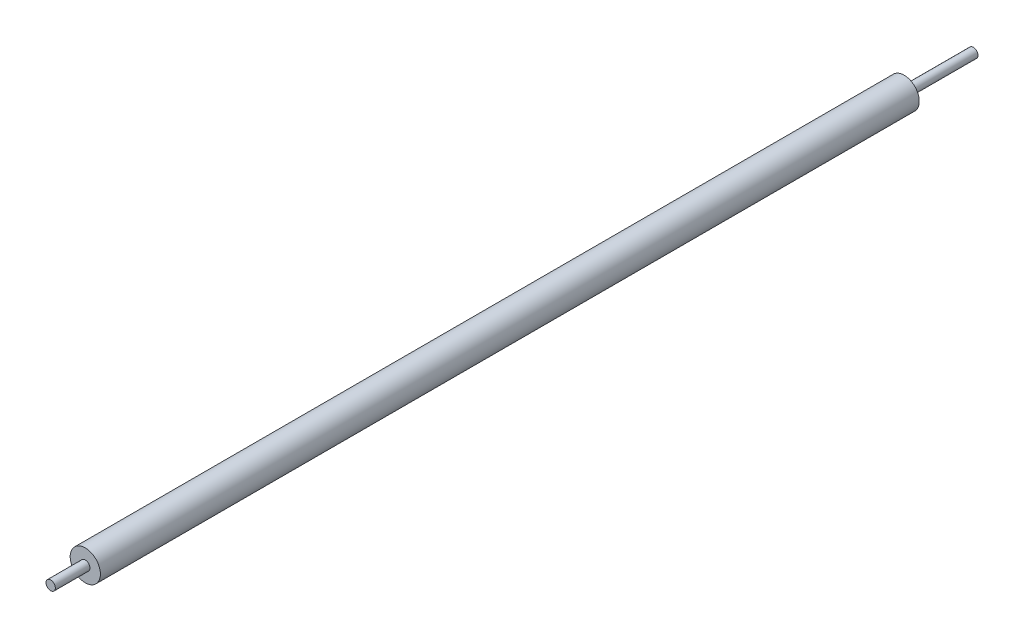
ISO-10303-21;
HEADER;
FILE_DESCRIPTION(('STEP AP214'),'2;1');
FILE_NAME('part.step','',(''),(''),'','','');
FILE_SCHEMA(('AUTOMOTIVE_DESIGN { 1 0 10303 214 1 1 1 1 }'));
ENDSEC;
DATA;
#1=APPLICATION_CONTEXT('core data for automotive mechanical design processes');
#2=APPLICATION_PROTOCOL_DEFINITION('international standard','automotive_design',2000,#1);
#3=PRODUCT_CONTEXT('',#1,'mechanical');
#4=PRODUCT('Part','Part','',(#3));
#5=PRODUCT_RELATED_PRODUCT_CATEGORY('part','',(#4));
#6=PRODUCT_DEFINITION_FORMATION('','',#4);
#7=PRODUCT_DEFINITION_CONTEXT('part definition',#1,'design');
#8=PRODUCT_DEFINITION('design','',#6,#7);
#9=PRODUCT_DEFINITION_SHAPE('','',#8);
#10=(LENGTH_UNIT() NAMED_UNIT(*) SI_UNIT(.MILLI.,.METRE.));
#11=(NAMED_UNIT(*) PLANE_ANGLE_UNIT() SI_UNIT($,.RADIAN.));
#12=(NAMED_UNIT(*) SI_UNIT($,.STERADIAN.) SOLID_ANGLE_UNIT());
#13=UNCERTAINTY_MEASURE_WITH_UNIT(LENGTH_MEASURE(1.E-05),#10,'distance_accuracy_value','');
#14=(GEOMETRIC_REPRESENTATION_CONTEXT(3) GLOBAL_UNCERTAINTY_ASSIGNED_CONTEXT((#13)) GLOBAL_UNIT_ASSIGNED_CONTEXT((#10,
#11,#12)) REPRESENTATION_CONTEXT('',''));
#15=CARTESIAN_POINT('',(0.,0.,0.));
#16=DIRECTION('',(0.,0.,1.));
#17=DIRECTION('',(1.,0.,0.));
#18=AXIS2_PLACEMENT_3D('',#15,#16,#17);
#19=CARTESIAN_POINT('',(0.,0.,83.7052395334175));
#20=DIRECTION('',(0.,0.,-1.));
#21=DIRECTION('',(-1.,0.,0.));
#22=AXIS2_PLACEMENT_3D('',#19,#20,#21);
#23=CYLINDRICAL_SURFACE('',#22,1.31);
#24=CARTESIAN_POINT('',(0.,0.,6.));
#25=DIRECTION('',(0.,0.,1.));
#26=DIRECTION('',(1.,0.,0.));
#27=AXIS2_PLACEMENT_3D('',#24,#25,#26);
#28=CIRCLE('',#27,1.31);
#29=CARTESIAN_POINT('',(1.31,0.,6.));
#30=VERTEX_POINT('',#29);
#31=EDGE_CURVE('E53',#30,#30,#28,.T.);
#32=ORIENTED_EDGE('',*,*,#31,.T.);
#33=EDGE_LOOP('',(#32));
#34=FACE_BOUND('',#33,.T.);
#35=CARTESIAN_POINT('',(0.,0.,77.));
#36=DIRECTION('',(0.,0.,1.));
#37=DIRECTION('',(1.,0.,0.));
#38=AXIS2_PLACEMENT_3D('',#35,#36,#37);
#39=CIRCLE('',#38,1.31);
#40=CARTESIAN_POINT('',(1.31,0.,77.));
#41=VERTEX_POINT('',#40);
#42=EDGE_CURVE('E11',#41,#41,#39,.T.);
#43=ORIENTED_EDGE('',*,*,#42,.F.);
#44=EDGE_LOOP('',(#43));
#45=FACE_BOUND('',#44,.T.);
#46=ADVANCED_FACE('F46',(#34,#45),#23,.T.);
#47=CARTESIAN_POINT('',(0.,0.,6.));
#48=DIRECTION('',(0.,0.,1.));
#49=DIRECTION('',(1.,0.,0.));
#50=AXIS2_PLACEMENT_3D('',#47,#48,#49);
#51=PLANE('',#50);
#52=ORIENTED_EDGE('',*,*,#31,.F.);
#53=EDGE_LOOP('',(#52));
#54=FACE_BOUND('',#53,.T.);
#55=CARTESIAN_POINT('',(0.,0.,6.));
#56=DIRECTION('',(0.,0.,1.));
#57=DIRECTION('',(1.,0.,0.));
#58=AXIS2_PLACEMENT_3D('',#55,#56,#57);
#59=CIRCLE('',#58,0.4064);
#60=CARTESIAN_POINT('',(0.4064,0.,6.));
#61=VERTEX_POINT('',#60);
#62=EDGE_CURVE('E58',#61,#61,#59,.T.);
#63=ORIENTED_EDGE('',*,*,#62,.T.);
#64=EDGE_LOOP('',(#63));
#65=FACE_BOUND('',#64,.T.);
#66=ADVANCED_FACE('F74',(#54,#65),#51,.F.);
#67=CARTESIAN_POINT('',(0.,0.,83.7052395334175));
#68=DIRECTION('',(0.,0.,-1.));
#69=DIRECTION('',(-1.,0.,0.));
#70=AXIS2_PLACEMENT_3D('',#67,#68,#69);
#71=CYLINDRICAL_SURFACE('',#70,0.4064);
#72=ORIENTED_EDGE('',*,*,#62,.F.);
#73=EDGE_LOOP('',(#72));
#74=FACE_BOUND('',#73,.T.);
#75=CARTESIAN_POINT('',(0.,0.,77.));
#76=DIRECTION('',(0.,0.,1.));
#77=DIRECTION('',(1.,0.,0.));
#78=AXIS2_PLACEMENT_3D('',#75,#76,#77);
#79=CIRCLE('',#78,0.4064);
#80=CARTESIAN_POINT('',(0.4064,0.,77.));
#81=VERTEX_POINT('',#80);
#82=EDGE_CURVE('E49',#81,#81,#79,.T.);
#83=ORIENTED_EDGE('',*,*,#82,.T.);
#84=EDGE_LOOP('',(#83));
#85=FACE_BOUND('',#84,.T.);
#86=ADVANCED_FACE('F66',(#74,#85),#71,.F.);
#87=CARTESIAN_POINT('',(0.,0.,77.));
#88=DIRECTION('',(0.,0.,1.));
#89=DIRECTION('',(1.,0.,0.));
#90=AXIS2_PLACEMENT_3D('',#87,#88,#89);
#91=PLANE('',#90);
#92=ORIENTED_EDGE('',*,*,#82,.F.);
#93=EDGE_LOOP('',(#92));
#94=FACE_BOUND('',#93,.T.);
#95=ORIENTED_EDGE('',*,*,#42,.T.);
#96=EDGE_LOOP('',(#95));
#97=FACE_BOUND('',#96,.T.);
#98=ADVANCED_FACE('F68',(#94,#97),#91,.T.);
#99=CLOSED_SHELL('',(#46,#66,#86,#98));
#100=MANIFOLD_SOLID_BREP('B2',#99);
#101=CARTESIAN_POINT('',(0.,0.,80.));
#102=DIRECTION('',(0.,0.,-1.));
#103=DIRECTION('',(-1.,0.,0.));
#104=AXIS2_PLACEMENT_3D('',#101,#102,#103);
#105=CYLINDRICAL_SURFACE('',#104,0.4064);
#106=CARTESIAN_POINT('',(0.,0.,80.));
#107=DIRECTION('',(0.,0.,1.));
#108=DIRECTION('',(1.,0.,0.));
#109=AXIS2_PLACEMENT_3D('',#106,#107,#108);
#110=CIRCLE('',#109,0.4064);
#111=CARTESIAN_POINT('',(0.4064,0.,80.));
#112=VERTEX_POINT('',#111);
#113=EDGE_CURVE('E45',#112,#112,#110,.T.);
#114=ORIENTED_EDGE('',*,*,#113,.F.);
#115=EDGE_LOOP('',(#114));
#116=FACE_BOUND('',#115,.T.);
#117=CARTESIAN_POINT('',(0.,0.,0.));
#118=DIRECTION('',(0.,0.,1.));
#119=DIRECTION('',(1.,0.,0.));
#120=AXIS2_PLACEMENT_3D('',#117,#118,#119);
#121=CIRCLE('',#120,0.4064);
#122=CARTESIAN_POINT('',(0.4064,0.,0.));
#123=VERTEX_POINT('',#122);
#124=EDGE_CURVE('E112',#123,#123,#121,.T.);
#125=ORIENTED_EDGE('',*,*,#124,.T.);
#126=EDGE_LOOP('',(#125));
#127=FACE_BOUND('',#126,.T.);
#128=ADVANCED_FACE('F109',(#116,#127),#105,.T.);
#129=CARTESIAN_POINT('',(0.,0.,80.));
#130=DIRECTION('',(0.,0.,1.));
#131=DIRECTION('',(1.,0.,0.));
#132=AXIS2_PLACEMENT_3D('',#129,#130,#131);
#133=PLANE('',#132);
#134=ORIENTED_EDGE('',*,*,#113,.T.);
#135=EDGE_LOOP('',(#134));
#136=FACE_BOUND('',#135,.T.);
#137=ADVANCED_FACE('F124',(#136),#133,.T.);
#138=CARTESIAN_POINT('',(0.,0.,0.));
#139=DIRECTION('',(0.,0.,1.));
#140=DIRECTION('',(1.,0.,0.));
#141=AXIS2_PLACEMENT_3D('',#138,#139,#140);
#142=PLANE('',#141);
#143=ORIENTED_EDGE('',*,*,#124,.F.);
#144=EDGE_LOOP('',(#143));
#145=FACE_BOUND('',#144,.T.);
#146=ADVANCED_FACE('F122',(#145),#142,.F.);
#147=CLOSED_SHELL('',(#128,#137,#146));
#148=MANIFOLD_SOLID_BREP('B6',#147);
#149=ADVANCED_BREP_SHAPE_REPRESENTATION('',(#18,#100,#148),#14);
#150=SHAPE_DEFINITION_REPRESENTATION(#9,#149);
ENDSEC;
END-ISO-10303-21;
